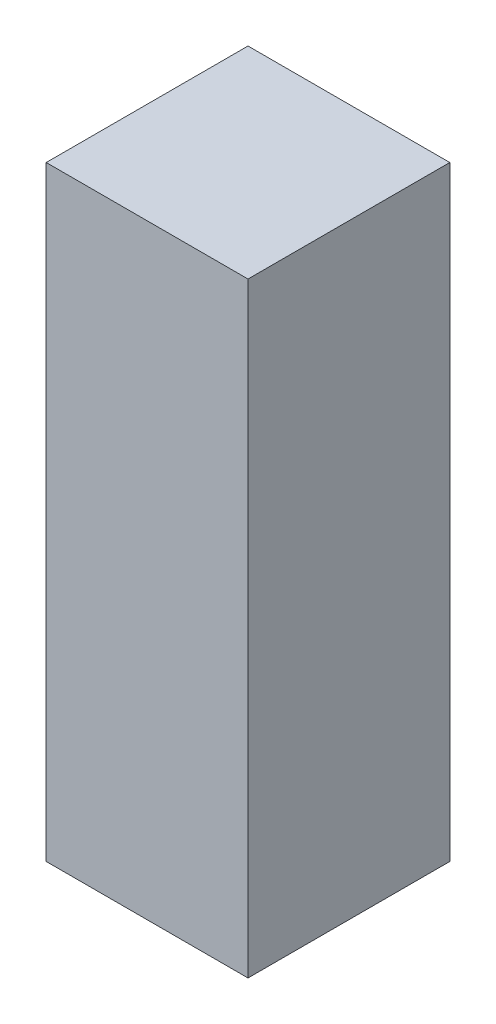
ISO-10303-21;
HEADER;
FILE_DESCRIPTION(('STEP AP214'),'2;1');
FILE_NAME('part.step','',(''),(''),'','','');
FILE_SCHEMA(('AUTOMOTIVE_DESIGN { 1 0 10303 214 1 1 1 1 }'));
ENDSEC;
DATA;
#1=APPLICATION_CONTEXT('core data for automotive mechanical design processes');
#2=APPLICATION_PROTOCOL_DEFINITION('international standard','automotive_design',2000,#1);
#3=PRODUCT_CONTEXT('',#1,'mechanical');
#4=PRODUCT('Part','Part','',(#3));
#5=PRODUCT_RELATED_PRODUCT_CATEGORY('part','',(#4));
#6=PRODUCT_DEFINITION_FORMATION('','',#4);
#7=PRODUCT_DEFINITION_CONTEXT('part definition',#1,'design');
#8=PRODUCT_DEFINITION('design','',#6,#7);
#9=PRODUCT_DEFINITION_SHAPE('','',#8);
#10=(LENGTH_UNIT() NAMED_UNIT(*) SI_UNIT(.MILLI.,.METRE.));
#11=(NAMED_UNIT(*) PLANE_ANGLE_UNIT() SI_UNIT($,.RADIAN.));
#12=(NAMED_UNIT(*) SI_UNIT($,.STERADIAN.) SOLID_ANGLE_UNIT());
#13=UNCERTAINTY_MEASURE_WITH_UNIT(LENGTH_MEASURE(1.E-05),#10,'distance_accuracy_value','');
#14=(GEOMETRIC_REPRESENTATION_CONTEXT(3) GLOBAL_UNCERTAINTY_ASSIGNED_CONTEXT((#13)) GLOBAL_UNIT_ASSIGNED_CONTEXT((#10,
#11,#12)) REPRESENTATION_CONTEXT('',''));
#15=CARTESIAN_POINT('',(0.,0.,0.));
#16=DIRECTION('',(0.,0.,1.));
#17=DIRECTION('',(1.,0.,0.));
#18=AXIS2_PLACEMENT_3D('',#15,#16,#17);
#19=CARTESIAN_POINT('',(-37.5,225.,37.5));
#20=DIRECTION('',(1.,0.,0.));
#21=DIRECTION('',(0.,0.,-1.));
#22=AXIS2_PLACEMENT_3D('',#19,#20,#21);
#23=PLANE('',#22);
#24=DIRECTION('',(0.,0.,1.));
#25=VECTOR('',#24,1.);
#26=CARTESIAN_POINT('',(-37.5,0.,37.5));
#27=LINE('',#26,#25);
#28=CARTESIAN_POINT('',(-37.5,0.,-37.5));
#29=VERTEX_POINT('',#28);
#30=CARTESIAN_POINT('',(-37.5,0.,37.5));
#31=VERTEX_POINT('',#30);
#32=EDGE_CURVE('E109',#29,#31,#27,.T.);
#33=ORIENTED_EDGE('',*,*,#32,.T.);
#34=DIRECTION('',(0.,-1.,0.));
#35=VECTOR('',#34,1.);
#36=CARTESIAN_POINT('',(-37.5,225.,37.5));
#37=LINE('',#36,#35);
#38=CARTESIAN_POINT('',(-37.5,225.,37.5));
#39=VERTEX_POINT('',#38);
#40=EDGE_CURVE('E11',#39,#31,#37,.T.);
#41=ORIENTED_EDGE('',*,*,#40,.F.);
#42=DIRECTION('',(0.,0.,1.));
#43=VECTOR('',#42,1.);
#44=CARTESIAN_POINT('',(-37.5,225.,37.5));
#45=LINE('',#44,#43);
#46=CARTESIAN_POINT('',(-37.5,225.,-37.5));
#47=VERTEX_POINT('',#46);
#48=EDGE_CURVE('E93',#47,#39,#45,.T.);
#49=ORIENTED_EDGE('',*,*,#48,.F.);
#50=DIRECTION('',(0.,-1.,0.));
#51=VECTOR('',#50,1.);
#52=CARTESIAN_POINT('',(-37.5,225.,-37.5));
#53=LINE('',#52,#51);
#54=EDGE_CURVE('E105',#47,#29,#53,.T.);
#55=ORIENTED_EDGE('',*,*,#54,.T.);
#56=EDGE_LOOP('',(#33,#41,#49,#55));
#57=FACE_BOUND('',#56,.T.);
#58=ADVANCED_FACE('F41',(#57),#23,.F.);
#59=CARTESIAN_POINT('',(37.5,225.,37.5));
#60=DIRECTION('',(0.,0.,-1.));
#61=DIRECTION('',(-1.,0.,0.));
#62=AXIS2_PLACEMENT_3D('',#59,#60,#61);
#63=PLANE('',#62);
#64=DIRECTION('',(1.,0.,0.));
#65=VECTOR('',#64,1.);
#66=CARTESIAN_POINT('',(37.5,0.,37.5));
#67=LINE('',#66,#65);
#68=CARTESIAN_POINT('',(37.5,0.,37.5));
#69=VERTEX_POINT('',#68);
#70=EDGE_CURVE('E98',#31,#69,#67,.T.);
#71=ORIENTED_EDGE('',*,*,#70,.T.);
#72=DIRECTION('',(0.,-1.,0.));
#73=VECTOR('',#72,1.);
#74=CARTESIAN_POINT('',(37.5,225.,37.5));
#75=LINE('',#74,#73);
#76=CARTESIAN_POINT('',(37.5,225.,37.5));
#77=VERTEX_POINT('',#76);
#78=EDGE_CURVE('E50',#77,#69,#75,.T.);
#79=ORIENTED_EDGE('',*,*,#78,.F.);
#80=DIRECTION('',(1.,0.,0.));
#81=VECTOR('',#80,1.);
#82=CARTESIAN_POINT('',(37.5,225.,37.5));
#83=LINE('',#82,#81);
#84=EDGE_CURVE('E88',#39,#77,#83,.T.);
#85=ORIENTED_EDGE('',*,*,#84,.F.);
#86=ORIENTED_EDGE('',*,*,#40,.T.);
#87=EDGE_LOOP('',(#71,#79,#85,#86));
#88=FACE_BOUND('',#87,.T.);
#89=ADVANCED_FACE('F97',(#88),#63,.F.);
#90=CARTESIAN_POINT('',(37.5,225.,37.5));
#91=DIRECTION('',(-1.,0.,0.));
#92=DIRECTION('',(0.,0.,1.));
#93=AXIS2_PLACEMENT_3D('',#90,#91,#92);
#94=PLANE('',#93);
#95=DIRECTION('',(0.,0.,-1.));
#96=VECTOR('',#95,1.);
#97=CARTESIAN_POINT('',(37.5,0.,37.5));
#98=LINE('',#97,#96);
#99=CARTESIAN_POINT('',(37.5,0.,-37.5));
#100=VERTEX_POINT('',#99);
#101=EDGE_CURVE('E75',#69,#100,#98,.T.);
#102=ORIENTED_EDGE('',*,*,#101,.T.);
#103=DIRECTION('',(0.,-1.,0.));
#104=VECTOR('',#103,1.);
#105=CARTESIAN_POINT('',(37.5,225.,-37.5));
#106=LINE('',#105,#104);
#107=CARTESIAN_POINT('',(37.5,225.,-37.5));
#108=VERTEX_POINT('',#107);
#109=EDGE_CURVE('E100',#108,#100,#106,.T.);
#110=ORIENTED_EDGE('',*,*,#109,.F.);
#111=DIRECTION('',(0.,0.,-1.));
#112=VECTOR('',#111,1.);
#113=CARTESIAN_POINT('',(37.5,225.,37.5));
#114=LINE('',#113,#112);
#115=EDGE_CURVE('E91',#77,#108,#114,.T.);
#116=ORIENTED_EDGE('',*,*,#115,.F.);
#117=ORIENTED_EDGE('',*,*,#78,.T.);
#118=EDGE_LOOP('',(#102,#110,#116,#117));
#119=FACE_BOUND('',#118,.T.);
#120=ADVANCED_FACE('F101',(#119),#94,.F.);
#121=CARTESIAN_POINT('',(37.5,225.,-37.5));
#122=DIRECTION('',(0.,0.,1.));
#123=DIRECTION('',(1.,0.,0.));
#124=AXIS2_PLACEMENT_3D('',#121,#122,#123);
#125=PLANE('',#124);
#126=DIRECTION('',(-1.,0.,0.));
#127=VECTOR('',#126,1.);
#128=CARTESIAN_POINT('',(37.5,0.,-37.5));
#129=LINE('',#128,#127);
#130=EDGE_CURVE('E81',#100,#29,#129,.T.);
#131=ORIENTED_EDGE('',*,*,#130,.T.);
#132=ORIENTED_EDGE('',*,*,#54,.F.);
#133=DIRECTION('',(-1.,0.,0.));
#134=VECTOR('',#133,1.);
#135=CARTESIAN_POINT('',(37.5,225.,-37.5));
#136=LINE('',#135,#134);
#137=EDGE_CURVE('E58',#108,#47,#136,.T.);
#138=ORIENTED_EDGE('',*,*,#137,.F.);
#139=ORIENTED_EDGE('',*,*,#109,.T.);
#140=EDGE_LOOP('',(#131,#132,#138,#139));
#141=FACE_BOUND('',#140,.T.);
#142=ADVANCED_FACE('F122',(#141),#125,.F.);
#143=CARTESIAN_POINT('',(0.,225.,0.));
#144=DIRECTION('',(0.,1.,0.));
#145=DIRECTION('',(0.,0.,1.));
#146=AXIS2_PLACEMENT_3D('',#143,#144,#145);
#147=PLANE('',#146);
#148=ORIENTED_EDGE('',*,*,#48,.T.);
#149=ORIENTED_EDGE('',*,*,#84,.T.);
#150=ORIENTED_EDGE('',*,*,#115,.T.);
#151=ORIENTED_EDGE('',*,*,#137,.T.);
#152=EDGE_LOOP('',(#148,#149,#150,#151));
#153=FACE_BOUND('',#152,.T.);
#154=ADVANCED_FACE('F89',(#153),#147,.T.);
#155=CARTESIAN_POINT('',(0.,0.,0.));
#156=DIRECTION('',(0.,1.,0.));
#157=DIRECTION('',(0.,0.,1.));
#158=AXIS2_PLACEMENT_3D('',#155,#156,#157);
#159=PLANE('',#158);
#160=ORIENTED_EDGE('',*,*,#32,.F.);
#161=ORIENTED_EDGE('',*,*,#130,.F.);
#162=ORIENTED_EDGE('',*,*,#101,.F.);
#163=ORIENTED_EDGE('',*,*,#70,.F.);
#164=EDGE_LOOP('',(#160,#161,#162,#163));
#165=FACE_BOUND('',#164,.T.);
#166=ADVANCED_FACE('F125',(#165),#159,.F.);
#167=CLOSED_SHELL('',(#58,#89,#120,#142,#154,#166));
#168=MANIFOLD_SOLID_BREP('B2',#167);
#169=ADVANCED_BREP_SHAPE_REPRESENTATION('',(#18,#168),#14);
#170=SHAPE_DEFINITION_REPRESENTATION(#9,#169);
ENDSEC;
END-ISO-10303-21;
